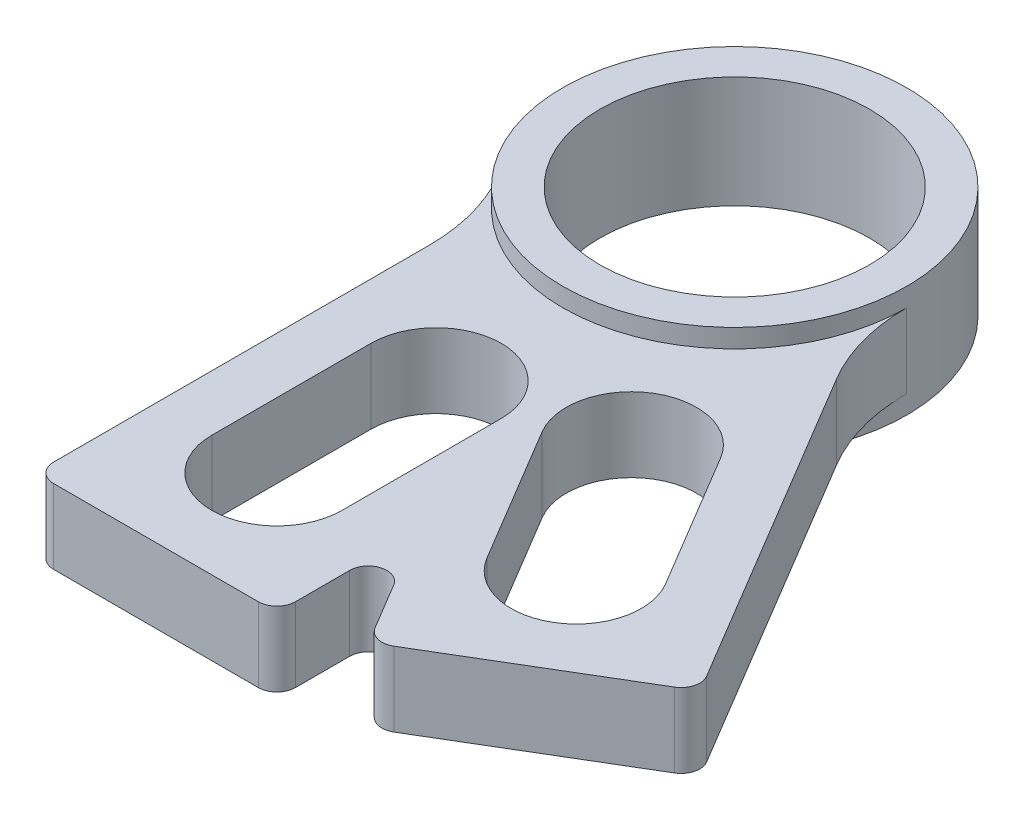
ISO-10303-21;
HEADER;
FILE_DESCRIPTION(('STEP AP214'),'2;1');
FILE_NAME('part.step','',(''),(''),'','','');
FILE_SCHEMA(('AUTOMOTIVE_DESIGN { 1 0 10303 214 1 1 1 1 }'));
ENDSEC;
DATA;
#1=APPLICATION_CONTEXT('core data for automotive mechanical design processes');
#2=APPLICATION_PROTOCOL_DEFINITION('international standard','automotive_design',2000,#1);
#3=PRODUCT_CONTEXT('',#1,'mechanical');
#4=PRODUCT('Part','Part','',(#3));
#5=PRODUCT_RELATED_PRODUCT_CATEGORY('part','',(#4));
#6=PRODUCT_DEFINITION_FORMATION('','',#4);
#7=PRODUCT_DEFINITION_CONTEXT('part definition',#1,'design');
#8=PRODUCT_DEFINITION('design','',#6,#7);
#9=PRODUCT_DEFINITION_SHAPE('','',#8);
#10=(LENGTH_UNIT() NAMED_UNIT(*) SI_UNIT(.MILLI.,.METRE.));
#11=(NAMED_UNIT(*) PLANE_ANGLE_UNIT() SI_UNIT($,.RADIAN.));
#12=(NAMED_UNIT(*) SI_UNIT($,.STERADIAN.) SOLID_ANGLE_UNIT());
#13=UNCERTAINTY_MEASURE_WITH_UNIT(LENGTH_MEASURE(1.E-05),#10,'distance_accuracy_value','');
#14=(GEOMETRIC_REPRESENTATION_CONTEXT(3) GLOBAL_UNCERTAINTY_ASSIGNED_CONTEXT((#13)) GLOBAL_UNIT_ASSIGNED_CONTEXT((#10,
#11,#12)) REPRESENTATION_CONTEXT('',''));
#15=CARTESIAN_POINT('',(0.,0.,0.));
#16=DIRECTION('',(0.,0.,1.));
#17=DIRECTION('',(1.,0.,0.));
#18=AXIS2_PLACEMENT_3D('',#15,#16,#17);
#19=CARTESIAN_POINT('',(0.,4.7625,0.));
#20=DIRECTION('',(0.,-1.,0.));
#21=DIRECTION('',(0.,0.,-1.));
#22=AXIS2_PLACEMENT_3D('',#19,#20,#21);
#23=CYLINDRICAL_SURFACE('',#22,11.5062);
#24=CARTESIAN_POINT('',(0.,4.7625,0.));
#25=DIRECTION('',(0.,1.,0.));
#26=DIRECTION('',(0.,0.,1.));
#27=AXIS2_PLACEMENT_3D('',#24,#25,#26);
#28=CIRCLE('',#27,11.5062);
#29=CARTESIAN_POINT('',(0.,4.7625,-11.5062));
#30=VERTEX_POINT('',#29);
#31=EDGE_CURVE('E299',#30,#30,#28,.T.);
#32=CARTESIAN_POINT('',(0.,-4.7625,0.));
#33=DIRECTION('',(0.,1.,0.));
#34=DIRECTION('',(0.,0.,1.));
#35=AXIS2_PLACEMENT_3D('',#32,#33,#34);
#36=CIRCLE('',#35,11.5062);
#37=CARTESIAN_POINT('',(0.,-4.7625,-11.5062));
#38=VERTEX_POINT('',#37);
#39=EDGE_CURVE('E294',#38,#38,#36,.T.);
#40=CARTESIAN_POINT('',(0.,4.7625,-11.5062));
#41=CARTESIAN_POINT('',(0.,4.66328125,-11.5062));
#42=CARTESIAN_POINT('',(0.,4.5640625,-11.5062));
#43=CARTESIAN_POINT('',(0.,4.365625,-11.5062));
#44=CARTESIAN_POINT('',(0.,4.26640625,-11.5062));
#45=CARTESIAN_POINT('',(0.,4.06796875,-11.5062));
#46=CARTESIAN_POINT('',(0.,3.96875,-11.5062));
#47=CARTESIAN_POINT('',(0.,3.7703125,-11.5062));
#48=CARTESIAN_POINT('',(0.,3.67109375,-11.5062));
#49=CARTESIAN_POINT('',(0.,3.47265625,-11.5062));
#50=CARTESIAN_POINT('',(0.,3.3734375,-11.5062));
#51=CARTESIAN_POINT('',(0.,3.175,-11.5062));
#52=CARTESIAN_POINT('',(0.,3.07578125,-11.5062));
#53=CARTESIAN_POINT('',(0.,2.87734375,-11.5062));
#54=CARTESIAN_POINT('',(0.,2.778125,-11.5062));
#55=CARTESIAN_POINT('',(0.,2.5796875,-11.5062));
#56=CARTESIAN_POINT('',(0.,2.48046875,-11.5062));
#57=CARTESIAN_POINT('',(0.,2.28203125,-11.5062));
#58=CARTESIAN_POINT('',(0.,2.1828125,-11.5062));
#59=CARTESIAN_POINT('',(0.,1.984375,-11.5062));
#60=CARTESIAN_POINT('',(0.,1.88515625,-11.5062));
#61=CARTESIAN_POINT('',(0.,1.68671875,-11.5062));
#62=CARTESIAN_POINT('',(0.,1.5875,-11.5062));
#63=CARTESIAN_POINT('',(0.,1.3890625,-11.5062));
#64=CARTESIAN_POINT('',(0.,1.28984375,-11.5062));
#65=CARTESIAN_POINT('',(0.,1.09140625,-11.5062));
#66=CARTESIAN_POINT('',(0.,0.992187499999999,-11.5062));
#67=CARTESIAN_POINT('',(0.,0.79375,-11.5062));
#68=CARTESIAN_POINT('',(0.,0.69453125,-11.5062));
#69=CARTESIAN_POINT('',(0.,0.49609375,-11.5062));
#70=CARTESIAN_POINT('',(0.,0.396875,-11.5062));
#71=CARTESIAN_POINT('',(0.,0.1984375,-11.5062));
#72=CARTESIAN_POINT('',(0.,0.0992187500000001,-11.5062));
#73=CARTESIAN_POINT('',(0.,-0.0992187500000001,-11.5062));
#74=CARTESIAN_POINT('',(0.,-0.1984375,-11.5062));
#75=CARTESIAN_POINT('',(0.,-0.396875,-11.5062));
#76=CARTESIAN_POINT('',(0.,-0.49609375,-11.5062));
#77=CARTESIAN_POINT('',(0.,-0.69453125,-11.5062));
#78=CARTESIAN_POINT('',(0.,-0.793750000000001,-11.5062));
#79=CARTESIAN_POINT('',(0.,-0.992187500000001,-11.5062));
#80=CARTESIAN_POINT('',(0.,-1.09140625,-11.5062));
#81=CARTESIAN_POINT('',(0.,-1.28984375,-11.5062));
#82=CARTESIAN_POINT('',(0.,-1.3890625,-11.5062));
#83=CARTESIAN_POINT('',(0.,-1.5875,-11.5062));
#84=CARTESIAN_POINT('',(0.,-1.68671875,-11.5062));
#85=CARTESIAN_POINT('',(0.,-1.88515625,-11.5062));
#86=CARTESIAN_POINT('',(0.,-1.984375,-11.5062));
#87=CARTESIAN_POINT('',(0.,-2.1828125,-11.5062));
#88=CARTESIAN_POINT('',(0.,-2.28203125,-11.5062));
#89=CARTESIAN_POINT('',(0.,-2.48046875,-11.5062));
#90=CARTESIAN_POINT('',(0.,-2.5796875,-11.5062));
#91=CARTESIAN_POINT('',(0.,-2.778125,-11.5062));
#92=CARTESIAN_POINT('',(0.,-2.87734375,-11.5062));
#93=CARTESIAN_POINT('',(0.,-3.07578125,-11.5062));
#94=CARTESIAN_POINT('',(0.,-3.175,-11.5062));
#95=CARTESIAN_POINT('',(0.,-3.3734375,-11.5062));
#96=CARTESIAN_POINT('',(0.,-3.47265625,-11.5062));
#97=CARTESIAN_POINT('',(0.,-3.67109375,-11.5062));
#98=CARTESIAN_POINT('',(0.,-3.7703125,-11.5062));
#99=CARTESIAN_POINT('',(0.,-3.96875,-11.5062));
#100=CARTESIAN_POINT('',(0.,-4.06796875,-11.5062));
#101=CARTESIAN_POINT('',(0.,-4.26640625,-11.5062));
#102=CARTESIAN_POINT('',(0.,-4.365625,-11.5062));
#103=CARTESIAN_POINT('',(0.,-4.5640625,-11.5062));
#104=CARTESIAN_POINT('',(0.,-4.66328125,-11.5062));
#105=CARTESIAN_POINT('',(0.,-4.7625,-11.5062));
#106=B_SPLINE_CURVE_WITH_KNOTS('',3,(#40,#41,#42,#43,#44,#45,#46,#47,#48,#49,#50,#51,#52,#53,
#54,#55,#56,#57,#58,#59,#60,#61,#62,#63,#64,#65,#66,#67,#68,#69,#70,#71,#72,#73,#74,#75,#76,#77,
#78,#79,#80,#81,#82,#83,#84,#85,#86,#87,#88,#89,#90,#91,#92,#93,#94,#95,#96,#97,#98,#99,#100,
#101,#102,#103,#104,#105),.UNSPECIFIED.,.F.,.F.,(4,2,2,2,2,2,2,2,2,2,2,2,2,2,2,2,2,2,2,2,2,2,2,
2,2,2,2,2,2,2,2,2,4),(0.,0.29765625,0.5953125,0.892968750000001,1.190625,1.48828125,1.7859375,
2.08359375,2.38125,2.67890625,2.9765625,3.27421875,3.571875,3.86953125,4.1671875,4.46484375,
4.7625,5.06015625,5.3578125,5.65546875,5.953125,6.25078125,6.5484375,6.84609375,7.14375,
7.44140625,7.7390625,8.03671875,8.334375,8.63203125,8.9296875,9.22734375,9.525),.UNSPECIFIED.);
#107=EDGE_CURVE('BSEAM41',#30,#38,#106,.T.);
#108=ORIENTED_EDGE('',*,*,#31,.T.);
#109=ORIENTED_EDGE('',*,*,#39,.F.);
#110=ORIENTED_EDGE('',*,*,#107,.T.);
#111=ORIENTED_EDGE('',*,*,#107,.F.);
#112=EDGE_LOOP('',(#108,#110,#109,#111));
#113=FACE_BOUND('',#112,.T.);
#114=ADVANCED_FACE('F41',(#113),#23,.F.);
#115=CARTESIAN_POINT('',(0.,4.7625,0.));
#116=DIRECTION('',(0.,-1.,0.));
#117=DIRECTION('',(0.,0.,-1.));
#118=AXIS2_PLACEMENT_3D('',#115,#116,#117);
#119=CYLINDRICAL_SURFACE('',#118,14.6812);
#120=DIRECTION('',(0.,-1.,0.));
#121=VECTOR('',#120,1.);
#122=CARTESIAN_POINT('',(14.6811803073208,4.7625,0.0240462873786636));
#123=LINE('',#122,#121);
#124=CARTESIAN_POINT('',(14.6811803073208,3.175,0.0240462873786636));
#125=VERTEX_POINT('',#124);
#126=CARTESIAN_POINT('',(14.6811803073208,-3.175,0.0240462873786636));
#127=VERTEX_POINT('',#126);
#128=EDGE_CURVE('E313',#125,#127,#123,.T.);
#129=ORIENTED_EDGE('',*,*,#128,.T.);
#130=CARTESIAN_POINT('',(0.,-3.175,0.));
#131=DIRECTION('',(0.,1.,0.));
#132=DIRECTION('',(0.,0.,1.));
#133=AXIS2_PLACEMENT_3D('',#130,#131,#132);
#134=CIRCLE('',#133,14.6812);
#135=CARTESIAN_POINT('',(-12.5938687913907,-3.175,7.54533646070437));
#136=VERTEX_POINT('',#135);
#137=EDGE_CURVE('E270',#136,#127,#134,.T.);
#138=ORIENTED_EDGE('',*,*,#137,.F.);
#139=DIRECTION('',(0.,-1.,0.));
#140=VECTOR('',#139,1.);
#141=CARTESIAN_POINT('',(-12.5938687913907,4.7625,7.54533646070436));
#142=LINE('',#141,#140);
#143=CARTESIAN_POINT('',(-12.5938687913907,3.175,7.54533646070437));
#144=VERTEX_POINT('',#143);
#145=EDGE_CURVE('E306',#136,#144,#142,.F.);
#146=ORIENTED_EDGE('',*,*,#145,.T.);
#147=CARTESIAN_POINT('',(0.,3.175,0.));
#148=DIRECTION('',(0.,1.,0.));
#149=DIRECTION('',(0.,0.,1.));
#150=AXIS2_PLACEMENT_3D('',#147,#148,#149);
#151=CIRCLE('',#150,14.6812);
#152=EDGE_CURVE('E232',#144,#125,#151,.T.);
#153=ORIENTED_EDGE('',*,*,#152,.T.);
#154=EDGE_LOOP('',(#129,#138,#146,#153));
#155=FACE_BOUND('',#154,.T.);
#156=CARTESIAN_POINT('',(0.,4.7625,0.));
#157=DIRECTION('',(0.,1.,0.));
#158=DIRECTION('',(0.,0.,1.));
#159=AXIS2_PLACEMENT_3D('',#156,#157,#158);
#160=CIRCLE('',#159,14.6812);
#161=CARTESIAN_POINT('',(0.,4.7625,14.6812));
#162=VERTEX_POINT('',#161);
#163=EDGE_CURVE('E302',#162,#162,#160,.T.);
#164=ORIENTED_EDGE('',*,*,#163,.F.);
#165=EDGE_LOOP('',(#164));
#166=FACE_BOUND('',#165,.T.);
#167=CARTESIAN_POINT('',(0.,-4.7625,0.));
#168=DIRECTION('',(0.,1.,0.));
#169=DIRECTION('',(0.,0.,1.));
#170=AXIS2_PLACEMENT_3D('',#167,#168,#169);
#171=CIRCLE('',#170,14.6812);
#172=CARTESIAN_POINT('',(0.,-4.7625,14.6812));
#173=VERTEX_POINT('',#172);
#174=EDGE_CURVE('E303',#173,#173,#171,.T.);
#175=ORIENTED_EDGE('',*,*,#174,.T.);
#176=EDGE_LOOP('',(#175));
#177=FACE_BOUND('',#176,.T.);
#178=ADVANCED_FACE('F409',(#155,#166,#177),#119,.T.);
#179=CARTESIAN_POINT('',(0.,4.7625,0.));
#180=DIRECTION('',(0.,1.,0.));
#181=DIRECTION('',(0.,0.,1.));
#182=AXIS2_PLACEMENT_3D('',#179,#180,#181);
#183=PLANE('',#182);
#184=ORIENTED_EDGE('',*,*,#31,.F.);
#185=EDGE_LOOP('',(#184));
#186=FACE_BOUND('',#185,.T.);
#187=ORIENTED_EDGE('',*,*,#163,.T.);
#188=EDGE_LOOP('',(#187));
#189=FACE_BOUND('',#188,.T.);
#190=ADVANCED_FACE('F445',(#186,#189),#183,.T.);
#191=CARTESIAN_POINT('',(0.,-4.7625,0.));
#192=DIRECTION('',(0.,1.,0.));
#193=DIRECTION('',(0.,0.,1.));
#194=AXIS2_PLACEMENT_3D('',#191,#192,#193);
#195=PLANE('',#194);
#196=ORIENTED_EDGE('',*,*,#39,.T.);
#197=EDGE_LOOP('',(#196));
#198=FACE_BOUND('',#197,.T.);
#199=ORIENTED_EDGE('',*,*,#174,.F.);
#200=EDGE_LOOP('',(#199));
#201=FACE_BOUND('',#200,.T.);
#202=ADVANCED_FACE('F619',(#198,#201),#195,.F.);
#203=CARTESIAN_POINT('',(-10.31875,3.175,0.));
#204=DIRECTION('',(-1.,0.,0.));
#205=DIRECTION('',(0.,0.,1.));
#206=AXIS2_PLACEMENT_3D('',#203,#204,#205);
#207=PLANE('',#206);
#208=DIRECTION('',(0.,0.,-1.));
#209=VECTOR('',#208,1.);
#210=CARTESIAN_POINT('',(-10.31875,-3.175,0.));
#211=LINE('',#210,#209);
#212=CARTESIAN_POINT('',(-10.31875,-3.175,47.8028));
#213=VERTEX_POINT('',#212);
#214=CARTESIAN_POINT('',(-10.31875,-3.175,15.7694921185655));
#215=VERTEX_POINT('',#214);
#216=EDGE_CURVE('E272',#213,#215,#211,.T.);
#217=ORIENTED_EDGE('',*,*,#216,.F.);
#218=DIRECTION('',(0.,-1.,0.));
#219=VECTOR('',#218,1.);
#220=CARTESIAN_POINT('',(-10.31875,3.175,47.8028));
#221=LINE('',#220,#219);
#222=CARTESIAN_POINT('',(-10.31875,3.175,47.8028));
#223=VERTEX_POINT('',#222);
#224=EDGE_CURVE('E372',#213,#223,#221,.F.);
#225=ORIENTED_EDGE('',*,*,#224,.T.);
#226=DIRECTION('',(0.,0.,-1.));
#227=VECTOR('',#226,1.);
#228=CARTESIAN_POINT('',(-10.31875,3.175,0.));
#229=LINE('',#228,#227);
#230=CARTESIAN_POINT('',(-10.31875,3.175,15.7694921185655));
#231=VERTEX_POINT('',#230);
#232=EDGE_CURVE('E234',#223,#231,#229,.T.);
#233=ORIENTED_EDGE('',*,*,#232,.T.);
#234=DIRECTION('',(0.,-1.,0.));
#235=VECTOR('',#234,1.);
#236=CARTESIAN_POINT('',(-10.31875,3.175,15.7694921185655));
#237=LINE('',#236,#235);
#238=EDGE_CURVE('E319',#231,#215,#237,.T.);
#239=ORIENTED_EDGE('',*,*,#238,.T.);
#240=EDGE_LOOP('',(#217,#225,#233,#239));
#241=FACE_BOUND('',#240,.T.);
#242=ADVANCED_FACE('F611',(#241),#207,.T.);
#243=CARTESIAN_POINT('',(0.,3.175,49.3903));
#244=DIRECTION('',(0.,0.,-1.));
#245=DIRECTION('',(-1.,0.,0.));
#246=AXIS2_PLACEMENT_3D('',#243,#244,#245);
#247=PLANE('',#246);
#248=DIRECTION('',(1.,0.,0.));
#249=VECTOR('',#248,1.);
#250=CARTESIAN_POINT('',(0.,-3.175,49.3903));
#251=LINE('',#250,#249);
#252=CARTESIAN_POINT('',(-8.73124999999999,-3.175,49.3903));
#253=VERTEX_POINT('',#252);
#254=CARTESIAN_POINT('',(8.73125,-3.175,49.3903));
#255=VERTEX_POINT('',#254);
#256=EDGE_CURVE('E274',#253,#255,#251,.T.);
#257=ORIENTED_EDGE('',*,*,#256,.T.);
#258=DIRECTION('',(0.,-1.,0.));
#259=VECTOR('',#258,1.);
#260=CARTESIAN_POINT('',(8.73125,3.175,49.3903));
#261=LINE('',#260,#259);
#262=CARTESIAN_POINT('',(8.73125,3.175,49.3903));
#263=VERTEX_POINT('',#262);
#264=EDGE_CURVE('E370',#255,#263,#261,.F.);
#265=ORIENTED_EDGE('',*,*,#264,.T.);
#266=DIRECTION('',(1.,0.,0.));
#267=VECTOR('',#266,1.);
#268=CARTESIAN_POINT('',(0.,3.175,49.3903));
#269=LINE('',#268,#267);
#270=CARTESIAN_POINT('',(-8.73124999999999,3.175,49.3903));
#271=VERTEX_POINT('',#270);
#272=EDGE_CURVE('E236',#271,#263,#269,.T.);
#273=ORIENTED_EDGE('',*,*,#272,.F.);
#274=DIRECTION('',(0.,-1.,0.));
#275=VECTOR('',#274,1.);
#276=CARTESIAN_POINT('',(-8.73124999999999,-3.175,49.3903));
#277=LINE('',#276,#275);
#278=EDGE_CURVE('E367',#271,#253,#277,.T.);
#279=ORIENTED_EDGE('',*,*,#278,.T.);
#280=EDGE_LOOP('',(#257,#265,#273,#279));
#281=FACE_BOUND('',#280,.T.);
#282=ADVANCED_FACE('F426',(#281),#247,.F.);
#283=CARTESIAN_POINT('',(10.31875,3.175,0.));
#284=DIRECTION('',(-1.,0.,0.));
#285=DIRECTION('',(0.,0.,1.));
#286=AXIS2_PLACEMENT_3D('',#283,#284,#285);
#287=PLANE('',#286);
#288=DIRECTION('',(0.,0.,-1.));
#289=VECTOR('',#288,1.);
#290=CARTESIAN_POINT('',(10.31875,-3.175,0.));
#291=LINE('',#290,#289);
#292=CARTESIAN_POINT('',(10.31875,-3.175,47.8028));
#293=VERTEX_POINT('',#292);
#294=CARTESIAN_POINT('',(10.31875,-3.175,43.1765755406219));
#295=VERTEX_POINT('',#294);
#296=EDGE_CURVE('E277',#293,#295,#291,.T.);
#297=ORIENTED_EDGE('',*,*,#296,.T.);
#298=DIRECTION('',(0.,-1.,0.));
#299=VECTOR('',#298,1.);
#300=CARTESIAN_POINT('',(10.31875,3.175,43.1765755406219));
#301=LINE('',#300,#299);
#302=CARTESIAN_POINT('',(10.31875,3.175,43.1765755406219));
#303=VERTEX_POINT('',#302);
#304=EDGE_CURVE('E365',#295,#303,#301,.F.);
#305=ORIENTED_EDGE('',*,*,#304,.T.);
#306=DIRECTION('',(0.,0.,-1.));
#307=VECTOR('',#306,1.);
#308=CARTESIAN_POINT('',(10.31875,3.175,0.));
#309=LINE('',#308,#307);
#310=CARTESIAN_POINT('',(10.31875,3.175,47.8028));
#311=VERTEX_POINT('',#310);
#312=EDGE_CURVE('E239',#311,#303,#309,.T.);
#313=ORIENTED_EDGE('',*,*,#312,.F.);
#314=DIRECTION('',(0.,-1.,0.));
#315=VECTOR('',#314,1.);
#316=CARTESIAN_POINT('',(10.31875,3.175,47.8028));
#317=LINE('',#316,#315);
#318=EDGE_CURVE('E362',#311,#293,#317,.T.);
#319=ORIENTED_EDGE('',*,*,#318,.T.);
#320=EDGE_LOOP('',(#297,#305,#313,#319));
#321=FACE_BOUND('',#320,.T.);
#322=ADVANCED_FACE('F381',(#321),#287,.F.);
#323=CARTESIAN_POINT('',(-8.8603338523033,3.175,5.28876976131757));
#324=DIRECTION('',(-0.858663486595115,0.,0.512539770933262));
#325=DIRECTION('',(0.512539770933262,0.,0.858663486595115));
#326=AXIS2_PLACEMENT_3D('',#323,#324,#325);
#327=PLANE('',#326);
#328=DIRECTION('',(-0.512539770933262,0.,-0.858663486595115));
#329=VECTOR('',#328,1.);
#330=CARTESIAN_POINT('',(-8.8603338523033,-3.175,5.28876976131757));
#331=LINE('',#330,#329);
#332=CARTESIAN_POINT('',(15.6405023096652,-3.175,46.3352886783265));
#333=VERTEX_POINT('',#332);
#334=CARTESIAN_POINT('',(13.2693782849697,-3.175,42.3629186542654));
#335=VERTEX_POINT('',#334);
#336=EDGE_CURVE('E280',#333,#335,#331,.T.);
#337=ORIENTED_EDGE('',*,*,#336,.F.);
#338=DIRECTION('',(0.,-1.,0.));
#339=VECTOR('',#338,1.);
#340=CARTESIAN_POINT('',(15.6405023096652,3.175,46.3352886783265));
#341=LINE('',#340,#339);
#342=CARTESIAN_POINT('',(15.6405023096652,3.175,46.3352886783265));
#343=VERTEX_POINT('',#342);
#344=EDGE_CURVE('E61',#333,#343,#341,.F.);
#345=ORIENTED_EDGE('',*,*,#344,.T.);
#346=DIRECTION('',(-0.512539770933262,0.,-0.858663486595115));
#347=VECTOR('',#346,1.);
#348=CARTESIAN_POINT('',(-8.8603338523033,3.175,5.28876976131757));
#349=LINE('',#348,#347);
#350=CARTESIAN_POINT('',(13.2693782849697,3.175,42.3629186542654));
#351=VERTEX_POINT('',#350);
#352=EDGE_CURVE('E241',#343,#351,#349,.T.);
#353=ORIENTED_EDGE('',*,*,#352,.T.);
#354=DIRECTION('',(0.,-1.,0.));
#355=VECTOR('',#354,1.);
#356=CARTESIAN_POINT('',(13.2693782849698,3.175,42.3629186542654));
#357=LINE('',#356,#355);
#358=EDGE_CURVE('E358',#351,#335,#357,.T.);
#359=ORIENTED_EDGE('',*,*,#358,.T.);
#360=EDGE_LOOP('',(#337,#345,#353,#359));
#361=FACE_BOUND('',#360,.T.);
#362=ADVANCED_FACE('F385',(#361),#327,.T.);
#363=CARTESIAN_POINT('',(25.3144930483251,3.175,42.4096472019787));
#364=DIRECTION('',(-0.512539770933262,0.,-0.858663486595115));
#365=DIRECTION('',(-0.858663486595115,0.,0.512539770933262));
#366=AXIS2_PLACEMENT_3D('',#363,#364,#365);
#367=PLANE('',#366);
#368=DIRECTION('',(0.858663486595115,0.,-0.512539770933262));
#369=VECTOR('',#368,1.);
#370=CARTESIAN_POINT('',(25.3144930483251,-3.175,42.4096472019787));
#371=LINE('',#370,#369);
#372=CARTESIAN_POINT('',(17.8172874809915,-3.175,46.8847600769397));
#373=VERTEX_POINT('',#372);
#374=CARTESIAN_POINT('',(32.8116986156587,-3.175,37.9345343270176));
#375=VERTEX_POINT('',#374);
#376=EDGE_CURVE('E283',#373,#375,#371,.T.);
#377=ORIENTED_EDGE('',*,*,#376,.T.);
#378=DIRECTION('',(0.,-1.,0.));
#379=VECTOR('',#378,1.);
#380=CARTESIAN_POINT('',(32.8116986156587,3.175,37.9345343270176));
#381=LINE('',#380,#379);
#382=CARTESIAN_POINT('',(32.8116986156587,3.175,37.9345343270176));
#383=VERTEX_POINT('',#382);
#384=EDGE_CURVE('E348',#375,#383,#381,.F.);
#385=ORIENTED_EDGE('',*,*,#384,.T.);
#386=DIRECTION('',(0.858663486595115,0.,-0.512539770933262));
#387=VECTOR('',#386,1.);
#388=CARTESIAN_POINT('',(25.3144930483251,3.175,42.4096472019787));
#389=LINE('',#388,#387);
#390=CARTESIAN_POINT('',(17.8172874809915,3.175,46.8847600769397));
#391=VERTEX_POINT('',#390);
#392=EDGE_CURVE('E243',#391,#383,#389,.T.);
#393=ORIENTED_EDGE('',*,*,#392,.F.);
#394=DIRECTION('',(0.,-1.,0.));
#395=VECTOR('',#394,1.);
#396=CARTESIAN_POINT('',(17.8172874809915,-3.175,46.8847600769397));
#397=LINE('',#396,#395);
#398=EDGE_CURVE('E345',#391,#373,#397,.T.);
#399=ORIENTED_EDGE('',*,*,#398,.T.);
#400=EDGE_LOOP('',(#377,#385,#393,#399));
#401=FACE_BOUND('',#400,.T.);
#402=ADVANCED_FACE('F393',(#401),#367,.F.);
#403=CARTESIAN_POINT('',(0.,3.175,25.48255));
#404=DIRECTION('',(0.,-1.,0.));
#405=DIRECTION('',(0.,0.,-1.));
#406=AXIS2_PLACEMENT_3D('',#403,#404,#405);
#407=CYLINDRICAL_SURFACE('',#406,5.55625);
#408=CARTESIAN_POINT('',(0.,-3.175,25.48255));
#409=DIRECTION('',(0.,1.,0.));
#410=DIRECTION('',(0.,0.,1.));
#411=AXIS2_PLACEMENT_3D('',#408,#409,#410);
#412=CIRCLE('',#411,5.55625);
#413=CARTESIAN_POINT('',(5.55625,-3.175,25.48255));
#414=VERTEX_POINT('',#413);
#415=CARTESIAN_POINT('',(-5.55624999999999,-3.175,25.48255));
#416=VERTEX_POINT('',#415);
#417=EDGE_CURVE('E258',#414,#416,#412,.T.);
#418=ORIENTED_EDGE('',*,*,#417,.F.);
#419=DIRECTION('',(0.,-1.,0.));
#420=VECTOR('',#419,1.);
#421=CARTESIAN_POINT('',(5.55625,3.175,25.48255));
#422=LINE('',#421,#420);
#423=CARTESIAN_POINT('',(5.55625,3.175,25.48255));
#424=VERTEX_POINT('',#423);
#425=EDGE_CURVE('E292',#424,#414,#422,.T.);
#426=ORIENTED_EDGE('',*,*,#425,.F.);
#427=CARTESIAN_POINT('',(0.,3.175,25.48255));
#428=DIRECTION('',(0.,1.,0.));
#429=DIRECTION('',(0.,0.,1.));
#430=AXIS2_PLACEMENT_3D('',#427,#428,#429);
#431=CIRCLE('',#430,5.55625);
#432=CARTESIAN_POINT('',(-5.55624999999999,3.175,25.48255));
#433=VERTEX_POINT('',#432);
#434=EDGE_CURVE('E221',#424,#433,#431,.T.);
#435=ORIENTED_EDGE('',*,*,#434,.T.);
#436=DIRECTION('',(0.,-1.,0.));
#437=VECTOR('',#436,1.);
#438=CARTESIAN_POINT('',(-5.55624999999999,3.175,25.48255));
#439=LINE('',#438,#437);
#440=EDGE_CURVE('E200',#433,#416,#439,.T.);
#441=ORIENTED_EDGE('',*,*,#440,.T.);
#442=EDGE_LOOP('',(#418,#426,#435,#441));
#443=FACE_BOUND('',#442,.T.);
#444=ADVANCED_FACE('F573',(#443),#407,.F.);
#445=CARTESIAN_POINT('',(5.55625,3.175,0.));
#446=DIRECTION('',(-1.,0.,0.));
#447=DIRECTION('',(0.,0.,1.));
#448=AXIS2_PLACEMENT_3D('',#445,#446,#447);
#449=PLANE('',#448);
#450=DIRECTION('',(0.,0.,-1.));
#451=VECTOR('',#450,1.);
#452=CARTESIAN_POINT('',(5.55625,-3.175,0.));
#453=LINE('',#452,#451);
#454=CARTESIAN_POINT('',(5.55625,-3.175,39.07155));
#455=VERTEX_POINT('',#454);
#456=EDGE_CURVE('E261',#455,#414,#453,.T.);
#457=ORIENTED_EDGE('',*,*,#456,.F.);
#458=DIRECTION('',(0.,-1.,0.));
#459=VECTOR('',#458,1.);
#460=CARTESIAN_POINT('',(5.55625,3.175,39.07155));
#461=LINE('',#460,#459);
#462=CARTESIAN_POINT('',(5.55625,3.175,39.07155));
#463=VERTEX_POINT('',#462);
#464=EDGE_CURVE('E290',#463,#455,#461,.T.);
#465=ORIENTED_EDGE('',*,*,#464,.F.);
#466=DIRECTION('',(0.,0.,-1.));
#467=VECTOR('',#466,1.);
#468=CARTESIAN_POINT('',(5.55625,3.175,0.));
#469=LINE('',#468,#467);
#470=EDGE_CURVE('E224',#463,#424,#469,.T.);
#471=ORIENTED_EDGE('',*,*,#470,.T.);
#472=ORIENTED_EDGE('',*,*,#425,.T.);
#473=EDGE_LOOP('',(#457,#465,#471,#472));
#474=FACE_BOUND('',#473,.T.);
#475=ADVANCED_FACE('F564',(#474),#449,.T.);
#476=CARTESIAN_POINT('',(0.,3.175,39.07155));
#477=DIRECTION('',(0.,-1.,0.));
#478=DIRECTION('',(0.,0.,-1.));
#479=AXIS2_PLACEMENT_3D('',#476,#477,#478);
#480=CYLINDRICAL_SURFACE('',#479,5.55625);
#481=CARTESIAN_POINT('',(0.,-3.175,39.07155));
#482=DIRECTION('',(0.,1.,0.));
#483=DIRECTION('',(0.,0.,1.));
#484=AXIS2_PLACEMENT_3D('',#481,#482,#483);
#485=CIRCLE('',#484,5.55625);
#486=CARTESIAN_POINT('',(-5.55625,-3.175,39.07155));
#487=VERTEX_POINT('',#486);
#488=EDGE_CURVE('E264',#487,#455,#485,.T.);
#489=ORIENTED_EDGE('',*,*,#488,.F.);
#490=DIRECTION('',(0.,-1.,0.));
#491=VECTOR('',#490,1.);
#492=CARTESIAN_POINT('',(-5.55625,3.175,39.07155));
#493=LINE('',#492,#491);
#494=CARTESIAN_POINT('',(-5.55625,3.175,39.07155));
#495=VERTEX_POINT('',#494);
#496=EDGE_CURVE('E288',#495,#487,#493,.T.);
#497=ORIENTED_EDGE('',*,*,#496,.F.);
#498=CARTESIAN_POINT('',(0.,3.175,39.07155));
#499=DIRECTION('',(0.,1.,0.));
#500=DIRECTION('',(0.,0.,1.));
#501=AXIS2_PLACEMENT_3D('',#498,#499,#500);
#502=CIRCLE('',#501,5.55625);
#503=EDGE_CURVE('E227',#495,#463,#502,.T.);
#504=ORIENTED_EDGE('',*,*,#503,.T.);
#505=ORIENTED_EDGE('',*,*,#464,.T.);
#506=EDGE_LOOP('',(#489,#497,#504,#505));
#507=FACE_BOUND('',#506,.T.);
#508=ADVANCED_FACE('F556',(#507),#480,.F.);
#509=CARTESIAN_POINT('',(13.0608203397954,3.175,21.8809352303343));
#510=DIRECTION('',(0.,-1.,0.));
#511=DIRECTION('',(0.,0.,-1.));
#512=AXIS2_PLACEMENT_3D('',#509,#510,#511);
#513=CYLINDRICAL_SURFACE('',#512,5.55624999999999);
#514=CARTESIAN_POINT('',(13.0608203397954,-3.175,21.8809352303343));
#515=DIRECTION('',(0.,1.,0.));
#516=DIRECTION('',(0.,0.,1.));
#517=AXIS2_PLACEMENT_3D('',#514,#515,#516);
#518=CIRCLE('',#517,5.55624999999999);
#519=CARTESIAN_POINT('',(17.8317693371895,-3.175,19.0331361280864));
#520=VERTEX_POINT('',#519);
#521=CARTESIAN_POINT('',(8.28987134240132,-3.175,24.7287343325823));
#522=VERTEX_POINT('',#521);
#523=EDGE_CURVE('E195',#520,#522,#518,.T.);
#524=ORIENTED_EDGE('',*,*,#523,.F.);
#525=DIRECTION('',(0.,-1.,0.));
#526=VECTOR('',#525,1.);
#527=CARTESIAN_POINT('',(17.8317693371895,3.175,19.0331361280864));
#528=LINE('',#527,#526);
#529=CARTESIAN_POINT('',(17.8317693371895,3.175,19.0331361280864));
#530=VERTEX_POINT('',#529);
#531=EDGE_CURVE('E190',#530,#520,#528,.T.);
#532=ORIENTED_EDGE('',*,*,#531,.F.);
#533=CARTESIAN_POINT('',(13.0608203397954,3.175,21.8809352303343));
#534=DIRECTION('',(0.,1.,0.));
#535=DIRECTION('',(0.,0.,1.));
#536=AXIS2_PLACEMENT_3D('',#533,#534,#535);
#537=CIRCLE('',#536,5.55624999999999);
#538=CARTESIAN_POINT('',(8.28987134240132,3.175,24.7287343325823));
#539=VERTEX_POINT('',#538);
#540=EDGE_CURVE('E193',#530,#539,#537,.T.);
#541=ORIENTED_EDGE('',*,*,#540,.T.);
#542=DIRECTION('',(0.,-1.,0.));
#543=VECTOR('',#542,1.);
#544=CARTESIAN_POINT('',(8.28987134240132,3.175,24.7287343325823));
#545=LINE('',#544,#543);
#546=EDGE_CURVE('E248',#539,#522,#545,.T.);
#547=ORIENTED_EDGE('',*,*,#546,.T.);
#548=EDGE_LOOP('',(#524,#532,#541,#547));
#549=FACE_BOUND('',#548,.T.);
#550=ADVANCED_FACE('F192',(#549),#513,.F.);
#551=CARTESIAN_POINT('',(4.77094899739411,3.175,-2.84779910224794));
#552=DIRECTION('',(-0.858663486595115,0.,0.512539770933262));
#553=DIRECTION('',(0.512539770933262,0.,0.858663486595115));
#554=AXIS2_PLACEMENT_3D('',#551,#552,#553);
#555=PLANE('',#554);
#556=DIRECTION('',(-0.512539770933262,0.,-0.858663486595115));
#557=VECTOR('',#556,1.);
#558=CARTESIAN_POINT('',(4.77094899739411,-3.175,-2.84779910224794));
#559=LINE('',#558,#557);
#560=CARTESIAN_POINT('',(24.7966722844016,-3.175,30.7015142474274));
#561=VERTEX_POINT('',#560);
#562=EDGE_CURVE('E250',#561,#520,#559,.T.);
#563=ORIENTED_EDGE('',*,*,#562,.F.);
#564=DIRECTION('',(0.,-1.,0.));
#565=VECTOR('',#564,1.);
#566=CARTESIAN_POINT('',(24.7966722844016,3.175,30.7015142474274));
#567=LINE('',#566,#565);
#568=CARTESIAN_POINT('',(24.7966722844016,3.175,30.7015142474274));
#569=VERTEX_POINT('',#568);
#570=EDGE_CURVE('E201',#569,#561,#567,.T.);
#571=ORIENTED_EDGE('',*,*,#570,.F.);
#572=DIRECTION('',(-0.512539770933262,0.,-0.858663486595115));
#573=VECTOR('',#572,1.);
#574=CARTESIAN_POINT('',(4.77094899739411,3.175,-2.84779910224794));
#575=LINE('',#574,#573);
#576=EDGE_CURVE('E208',#569,#530,#575,.T.);
#577=ORIENTED_EDGE('',*,*,#576,.T.);
#578=ORIENTED_EDGE('',*,*,#531,.T.);
#579=EDGE_LOOP('',(#563,#571,#577,#578));
#580=FACE_BOUND('',#579,.T.);
#581=ADVANCED_FACE('F215',(#580),#555,.T.);
#582=CARTESIAN_POINT('',(20.0257232870075,3.175,33.5493133496754));
#583=DIRECTION('',(0.,-1.,0.));
#584=DIRECTION('',(0.,0.,-1.));
#585=AXIS2_PLACEMENT_3D('',#582,#583,#584);
#586=CYLINDRICAL_SURFACE('',#585,5.55624999999999);
#587=CARTESIAN_POINT('',(20.0257232870075,-3.175,33.5493133496754));
#588=DIRECTION('',(0.,1.,0.));
#589=DIRECTION('',(0.,0.,1.));
#590=AXIS2_PLACEMENT_3D('',#587,#588,#589);
#591=CIRCLE('',#590,5.55624999999999);
#592=CARTESIAN_POINT('',(15.2547742896134,-3.175,36.3971124519233));
#593=VERTEX_POINT('',#592);
#594=EDGE_CURVE('E252',#593,#561,#591,.T.);
#595=ORIENTED_EDGE('',*,*,#594,.F.);
#596=DIRECTION('',(0.,-1.,0.));
#597=VECTOR('',#596,1.);
#598=CARTESIAN_POINT('',(15.2547742896134,3.175,36.3971124519233));
#599=LINE('',#598,#597);
#600=CARTESIAN_POINT('',(15.2547742896134,3.175,36.3971124519233));
#601=VERTEX_POINT('',#600);
#602=EDGE_CURVE('E296',#601,#593,#599,.T.);
#603=ORIENTED_EDGE('',*,*,#602,.F.);
#604=CARTESIAN_POINT('',(20.0257232870075,3.175,33.5493133496754));
#605=DIRECTION('',(0.,1.,0.));
#606=DIRECTION('',(0.,0.,1.));
#607=AXIS2_PLACEMENT_3D('',#604,#605,#606);
#608=CIRCLE('',#607,5.55624999999999);
#609=EDGE_CURVE('E216',#601,#569,#608,.T.);
#610=ORIENTED_EDGE('',*,*,#609,.T.);
#611=ORIENTED_EDGE('',*,*,#570,.T.);
#612=EDGE_LOOP('',(#595,#603,#610,#611));
#613=FACE_BOUND('',#612,.T.);
#614=ADVANCED_FACE('F532',(#613),#586,.F.);
#615=CARTESIAN_POINT('',(-5.55624999999999,3.175,0.));
#616=DIRECTION('',(-1.,0.,0.));
#617=DIRECTION('',(0.,0.,1.));
#618=AXIS2_PLACEMENT_3D('',#615,#616,#617);
#619=PLANE('',#618);
#620=DIRECTION('',(0.,0.,-1.));
#621=VECTOR('',#620,1.);
#622=CARTESIAN_POINT('',(-5.55624999999999,-3.175,0.));
#623=LINE('',#622,#621);
#624=EDGE_CURVE('E267',#487,#416,#623,.T.);
#625=ORIENTED_EDGE('',*,*,#624,.T.);
#626=ORIENTED_EDGE('',*,*,#440,.F.);
#627=DIRECTION('',(0.,0.,-1.));
#628=VECTOR('',#627,1.);
#629=CARTESIAN_POINT('',(-5.55624999999999,3.175,0.));
#630=LINE('',#629,#628);
#631=EDGE_CURVE('E230',#495,#433,#630,.T.);
#632=ORIENTED_EDGE('',*,*,#631,.F.);
#633=ORIENTED_EDGE('',*,*,#496,.T.);
#634=EDGE_LOOP('',(#625,#626,#632,#633));
#635=FACE_BOUND('',#634,.T.);
#636=ADVANCED_FACE('F523',(#635),#619,.F.);
#637=CARTESIAN_POINT('',(-4.77094899739408,3.175,2.84779910224792));
#638=DIRECTION('',(-0.858663486595115,0.,0.512539770933262));
#639=DIRECTION('',(0.512539770933262,0.,0.858663486595115));
#640=AXIS2_PLACEMENT_3D('',#637,#638,#639);
#641=PLANE('',#640);
#642=DIRECTION('',(-0.512539770933262,0.,-0.858663486595115));
#643=VECTOR('',#642,1.);
#644=CARTESIAN_POINT('',(-4.77094899739408,-3.175,2.84779910224792));
#645=LINE('',#644,#643);
#646=EDGE_CURVE('E255',#593,#522,#645,.T.);
#647=ORIENTED_EDGE('',*,*,#646,.T.);
#648=ORIENTED_EDGE('',*,*,#546,.F.);
#649=DIRECTION('',(-0.512539770933262,0.,-0.858663486595115));
#650=VECTOR('',#649,1.);
#651=CARTESIAN_POINT('',(-4.77094899739408,3.175,2.84779910224792));
#652=LINE('',#651,#650);
#653=EDGE_CURVE('E211',#601,#539,#652,.T.);
#654=ORIENTED_EDGE('',*,*,#653,.F.);
#655=ORIENTED_EDGE('',*,*,#602,.T.);
#656=EDGE_LOOP('',(#647,#648,#654,#655));
#657=FACE_BOUND('',#656,.T.);
#658=ADVANCED_FACE('F515',(#657),#641,.F.);
#659=CARTESIAN_POINT('',(8.86033385230336,3.175,-5.28876976131761));
#660=DIRECTION('',(-0.858663486595115,0.,0.512539770933262));
#661=DIRECTION('',(0.512539770933262,0.,0.858663486595115));
#662=AXIS2_PLACEMENT_3D('',#659,#660,#661);
#663=PLANE('',#662);
#664=DIRECTION('',(-0.512539770933262,0.,-0.858663486595115));
#665=VECTOR('',#664,1.);
#666=CARTESIAN_POINT('',(8.86033385230336,3.175,-5.28876976131761));
#667=LINE('',#666,#665);
#668=CARTESIAN_POINT('',(33.3611700142719,3.175,35.7577491556913));
#669=VERTEX_POINT('',#668);
#670=CARTESIAN_POINT('',(16.9428257304868,3.175,8.251917323044));
#671=VERTEX_POINT('',#670);
#672=EDGE_CURVE('E246',#669,#671,#667,.T.);
#673=ORIENTED_EDGE('',*,*,#672,.F.);
#674=DIRECTION('',(0.,-1.,0.));
#675=VECTOR('',#674,1.);
#676=CARTESIAN_POINT('',(33.3611700142719,3.175,35.7577491556913));
#677=LINE('',#676,#675);
#678=CARTESIAN_POINT('',(33.3611700142719,-3.175,35.7577491556913));
#679=VERTEX_POINT('',#678);
#680=EDGE_CURVE('E334',#669,#679,#677,.T.);
#681=ORIENTED_EDGE('',*,*,#680,.T.);
#682=DIRECTION('',(-0.512539770933262,0.,-0.858663486595115));
#683=VECTOR('',#682,1.);
#684=CARTESIAN_POINT('',(8.86033385230336,-3.175,-5.28876976131761));
#685=LINE('',#684,#683);
#686=CARTESIAN_POINT('',(16.9428257304868,-3.175,8.251917323044));
#687=VERTEX_POINT('',#686);
#688=EDGE_CURVE('E213',#679,#687,#685,.T.);
#689=ORIENTED_EDGE('',*,*,#688,.T.);
#690=DIRECTION('',(0.,1.,0.));
#691=VECTOR('',#690,1.);
#692=CARTESIAN_POINT('',(16.9428257304868,3.175,8.251917323044));
#693=LINE('',#692,#691);
#694=EDGE_CURVE('E316',#687,#671,#693,.T.);
#695=ORIENTED_EDGE('',*,*,#694,.T.);
#696=EDGE_LOOP('',(#673,#681,#689,#695));
#697=FACE_BOUND('',#696,.T.);
#698=ADVANCED_FACE('F401',(#697),#663,.F.);
#699=CARTESIAN_POINT('',(0.,3.175,0.));
#700=DIRECTION('',(0.,1.,0.));
#701=DIRECTION('',(0.,0.,1.));
#702=AXIS2_PLACEMENT_3D('',#699,#700,#701);
#703=PLANE('',#702);
#704=ORIENTED_EDGE('',*,*,#540,.F.);
#705=ORIENTED_EDGE('',*,*,#576,.F.);
#706=ORIENTED_EDGE('',*,*,#609,.F.);
#707=ORIENTED_EDGE('',*,*,#653,.T.);
#708=EDGE_LOOP('',(#704,#705,#706,#707));
#709=FACE_BOUND('',#708,.T.);
#710=ORIENTED_EDGE('',*,*,#434,.F.);
#711=ORIENTED_EDGE('',*,*,#470,.F.);
#712=ORIENTED_EDGE('',*,*,#503,.F.);
#713=ORIENTED_EDGE('',*,*,#631,.T.);
#714=EDGE_LOOP('',(#710,#711,#712,#713));
#715=FACE_BOUND('',#714,.T.);
#716=ORIENTED_EDGE('',*,*,#392,.T.);
#717=CARTESIAN_POINT('',(31.9980417293022,3.175,36.5714060420479));
#718=DIRECTION('',(0.,1.,0.));
#719=DIRECTION('',(0.,0.,1.));
#720=AXIS2_PLACEMENT_3D('',#717,#718,#719);
#721=CIRCLE('',#720,1.5875);
#722=EDGE_CURVE('E356',#383,#669,#721,.T.);
#723=ORIENTED_EDGE('',*,*,#722,.T.);
#724=ORIENTED_EDGE('',*,*,#672,.T.);
#725=CARTESIAN_POINT('',(30.6831588429818,3.175,0.0502559085699406));
#726=DIRECTION('',(0.,1.,0.));
#727=DIRECTION('',(0.,0.,1.));
#728=AXIS2_PLACEMENT_3D('',#725,#726,#727);
#729=CIRCLE('',#728,16.002);
#730=EDGE_CURVE('E325',#671,#125,#729,.F.);
#731=ORIENTED_EDGE('',*,*,#730,.T.);
#732=ORIENTED_EDGE('',*,*,#152,.F.);
#733=CARTESIAN_POINT('',(-26.32075,3.175,15.7694921185655));
#734=DIRECTION('',(0.,1.,0.));
#735=DIRECTION('',(0.,0.,1.));
#736=AXIS2_PLACEMENT_3D('',#733,#734,#735);
#737=CIRCLE('',#736,16.002);
#738=EDGE_CURVE('E331',#144,#231,#737,.F.);
#739=ORIENTED_EDGE('',*,*,#738,.T.);
#740=ORIENTED_EDGE('',*,*,#232,.F.);
#741=CARTESIAN_POINT('',(-8.73124999999999,3.175,47.8028));
#742=DIRECTION('',(0.,1.,0.));
#743=DIRECTION('',(0.,0.,1.));
#744=AXIS2_PLACEMENT_3D('',#741,#742,#743);
#745=CIRCLE('',#744,1.5875);
#746=EDGE_CURVE('E350',#223,#271,#745,.T.);
#747=ORIENTED_EDGE('',*,*,#746,.T.);
#748=ORIENTED_EDGE('',*,*,#272,.T.);
#749=CARTESIAN_POINT('',(8.73125,3.175,47.8028));
#750=DIRECTION('',(0.,1.,0.));
#751=DIRECTION('',(0.,0.,1.));
#752=AXIS2_PLACEMENT_3D('',#749,#750,#751);
#753=CIRCLE('',#752,1.5875);
#754=EDGE_CURVE('E352',#263,#311,#753,.T.);
#755=ORIENTED_EDGE('',*,*,#754,.T.);
#756=ORIENTED_EDGE('',*,*,#312,.T.);
#757=CARTESIAN_POINT('',(11.90625,3.175,43.1765755406219));
#758=DIRECTION('',(0.,1.,0.));
#759=DIRECTION('',(0.,0.,1.));
#760=AXIS2_PLACEMENT_3D('',#757,#758,#759);
#761=CIRCLE('',#760,1.5875);
#762=EDGE_CURVE('E11',#303,#351,#761,.F.);
#763=ORIENTED_EDGE('',*,*,#762,.T.);
#764=ORIENTED_EDGE('',*,*,#352,.F.);
#765=CARTESIAN_POINT('',(17.003630594635,3.175,45.52163179197));
#766=DIRECTION('',(0.,1.,0.));
#767=DIRECTION('',(0.,0.,1.));
#768=AXIS2_PLACEMENT_3D('',#765,#766,#767);
#769=CIRCLE('',#768,1.5875);
#770=EDGE_CURVE('E354',#343,#391,#769,.T.);
#771=ORIENTED_EDGE('',*,*,#770,.T.);
#772=EDGE_LOOP('',(#716,#723,#724,#731,#732,#739,#740,#747,#748,#755,#756,#763,#764,#771));
#773=FACE_BOUND('',#772,.T.);
#774=ADVANCED_FACE('F205',(#709,#715,#773),#703,.T.);
#775=CARTESIAN_POINT('',(0.,-3.175,0.));
#776=DIRECTION('',(0.,1.,0.));
#777=DIRECTION('',(0.,0.,1.));
#778=AXIS2_PLACEMENT_3D('',#775,#776,#777);
#779=PLANE('',#778);
#780=ORIENTED_EDGE('',*,*,#523,.T.);
#781=ORIENTED_EDGE('',*,*,#646,.F.);
#782=ORIENTED_EDGE('',*,*,#594,.T.);
#783=ORIENTED_EDGE('',*,*,#562,.T.);
#784=EDGE_LOOP('',(#780,#781,#782,#783));
#785=FACE_BOUND('',#784,.T.);
#786=ORIENTED_EDGE('',*,*,#417,.T.);
#787=ORIENTED_EDGE('',*,*,#624,.F.);
#788=ORIENTED_EDGE('',*,*,#488,.T.);
#789=ORIENTED_EDGE('',*,*,#456,.T.);
#790=EDGE_LOOP('',(#786,#787,#788,#789));
#791=FACE_BOUND('',#790,.T.);
#792=ORIENTED_EDGE('',*,*,#688,.F.);
#793=CARTESIAN_POINT('',(31.9980417293022,-3.175,36.5714060420479));
#794=DIRECTION('',(0.,1.,0.));
#795=DIRECTION('',(0.,0.,1.));
#796=AXIS2_PLACEMENT_3D('',#793,#794,#795);
#797=CIRCLE('',#796,1.5875);
#798=EDGE_CURVE('E343',#679,#375,#797,.F.);
#799=ORIENTED_EDGE('',*,*,#798,.T.);
#800=ORIENTED_EDGE('',*,*,#376,.F.);
#801=CARTESIAN_POINT('',(17.003630594635,-3.175,45.52163179197));
#802=DIRECTION('',(0.,1.,0.));
#803=DIRECTION('',(0.,0.,1.));
#804=AXIS2_PLACEMENT_3D('',#801,#802,#803);
#805=CIRCLE('',#804,1.5875);
#806=EDGE_CURVE('E341',#373,#333,#805,.F.);
#807=ORIENTED_EDGE('',*,*,#806,.T.);
#808=ORIENTED_EDGE('',*,*,#336,.T.);
#809=CARTESIAN_POINT('',(11.90625,-3.175,43.1765755406219));
#810=DIRECTION('',(0.,1.,0.));
#811=DIRECTION('',(0.,0.,1.));
#812=AXIS2_PLACEMENT_3D('',#809,#810,#811);
#813=CIRCLE('',#812,1.5875);
#814=EDGE_CURVE('E49',#335,#295,#813,.T.);
#815=ORIENTED_EDGE('',*,*,#814,.T.);
#816=ORIENTED_EDGE('',*,*,#296,.F.);
#817=CARTESIAN_POINT('',(8.73125,-3.175,47.8028));
#818=DIRECTION('',(0.,1.,0.));
#819=DIRECTION('',(0.,0.,1.));
#820=AXIS2_PLACEMENT_3D('',#817,#818,#819);
#821=CIRCLE('',#820,1.5875);
#822=EDGE_CURVE('E339',#293,#255,#821,.F.);
#823=ORIENTED_EDGE('',*,*,#822,.T.);
#824=ORIENTED_EDGE('',*,*,#256,.F.);
#825=CARTESIAN_POINT('',(-8.73124999999999,-3.175,47.8028));
#826=DIRECTION('',(0.,1.,0.));
#827=DIRECTION('',(0.,0.,1.));
#828=AXIS2_PLACEMENT_3D('',#825,#826,#827);
#829=CIRCLE('',#828,1.5875);
#830=EDGE_CURVE('E337',#253,#213,#829,.F.);
#831=ORIENTED_EDGE('',*,*,#830,.T.);
#832=ORIENTED_EDGE('',*,*,#216,.T.);
#833=CARTESIAN_POINT('',(-26.32075,-3.175,15.7694921185655));
#834=DIRECTION('',(0.,1.,0.));
#835=DIRECTION('',(0.,0.,1.));
#836=AXIS2_PLACEMENT_3D('',#833,#834,#835);
#837=CIRCLE('',#836,16.002);
#838=EDGE_CURVE('E328',#215,#136,#837,.T.);
#839=ORIENTED_EDGE('',*,*,#838,.T.);
#840=ORIENTED_EDGE('',*,*,#137,.T.);
#841=CARTESIAN_POINT('',(30.6831588429818,-3.175,0.0502559085699406));
#842=DIRECTION('',(0.,1.,0.));
#843=DIRECTION('',(0.,0.,1.));
#844=AXIS2_PLACEMENT_3D('',#841,#842,#843);
#845=CIRCLE('',#844,16.002);
#846=EDGE_CURVE('E322',#127,#687,#845,.T.);
#847=ORIENTED_EDGE('',*,*,#846,.T.);
#848=EDGE_LOOP('',(#792,#799,#800,#807,#808,#815,#816,#823,#824,#831,#832,#839,#840,#847));
#849=FACE_BOUND('',#848,.T.);
#850=ADVANCED_FACE('F376',(#785,#791,#849),#779,.F.);
#851=CARTESIAN_POINT('',(30.6831588429818,4.7625,0.0502559085699406));
#852=DIRECTION('',(0.,-1.,0.));
#853=DIRECTION('',(0.,0.,-1.));
#854=AXIS2_PLACEMENT_3D('',#851,#852,#853);
#855=CYLINDRICAL_SURFACE('',#854,16.002);
#856=ORIENTED_EDGE('',*,*,#730,.F.);
#857=ORIENTED_EDGE('',*,*,#694,.F.);
#858=ORIENTED_EDGE('',*,*,#846,.F.);
#859=ORIENTED_EDGE('',*,*,#128,.F.);
#860=EDGE_LOOP('',(#856,#857,#858,#859));
#861=FACE_BOUND('',#860,.T.);
#862=ADVANCED_FACE('F407',(#861),#855,.F.);
#863=CARTESIAN_POINT('',(-26.32075,4.7625,15.7694921185655));
#864=DIRECTION('',(0.,-1.,0.));
#865=DIRECTION('',(0.,0.,-1.));
#866=AXIS2_PLACEMENT_3D('',#863,#864,#865);
#867=CYLINDRICAL_SURFACE('',#866,16.002);
#868=ORIENTED_EDGE('',*,*,#738,.F.);
#869=ORIENTED_EDGE('',*,*,#145,.F.);
#870=ORIENTED_EDGE('',*,*,#838,.F.);
#871=ORIENTED_EDGE('',*,*,#238,.F.);
#872=EDGE_LOOP('',(#868,#869,#870,#871));
#873=FACE_BOUND('',#872,.T.);
#874=ADVANCED_FACE('F416',(#873),#867,.F.);
#875=CARTESIAN_POINT('',(31.9980417293022,3.175,36.5714060420479));
#876=DIRECTION('',(0.,-1.,0.));
#877=DIRECTION('',(0.,0.,-1.));
#878=AXIS2_PLACEMENT_3D('',#875,#876,#877);
#879=CYLINDRICAL_SURFACE('',#878,1.5875);
#880=ORIENTED_EDGE('',*,*,#722,.F.);
#881=ORIENTED_EDGE('',*,*,#384,.F.);
#882=ORIENTED_EDGE('',*,*,#798,.F.);
#883=ORIENTED_EDGE('',*,*,#680,.F.);
#884=EDGE_LOOP('',(#880,#881,#882,#883));
#885=FACE_BOUND('',#884,.T.);
#886=ADVANCED_FACE('F398',(#885),#879,.T.);
#887=CARTESIAN_POINT('',(17.003630594635,3.175,45.52163179197));
#888=DIRECTION('',(0.,1.,0.));
#889=DIRECTION('',(0.,0.,1.));
#890=AXIS2_PLACEMENT_3D('',#887,#888,#889);
#891=CYLINDRICAL_SURFACE('',#890,1.5875);
#892=ORIENTED_EDGE('',*,*,#770,.F.);
#893=ORIENTED_EDGE('',*,*,#344,.F.);
#894=ORIENTED_EDGE('',*,*,#806,.F.);
#895=ORIENTED_EDGE('',*,*,#398,.F.);
#896=EDGE_LOOP('',(#892,#893,#894,#895));
#897=FACE_BOUND('',#896,.T.);
#898=ADVANCED_FACE('F390',(#897),#891,.T.);
#899=CARTESIAN_POINT('',(11.90625,3.175,43.1765755406219));
#900=DIRECTION('',(0.,-1.,0.));
#901=DIRECTION('',(0.,0.,-1.));
#902=AXIS2_PLACEMENT_3D('',#899,#900,#901);
#903=CYLINDRICAL_SURFACE('',#902,1.5875);
#904=ORIENTED_EDGE('',*,*,#762,.F.);
#905=ORIENTED_EDGE('',*,*,#304,.F.);
#906=ORIENTED_EDGE('',*,*,#814,.F.);
#907=ORIENTED_EDGE('',*,*,#358,.F.);
#908=EDGE_LOOP('',(#904,#905,#906,#907));
#909=FACE_BOUND('',#908,.T.);
#910=ADVANCED_FACE('F384',(#909),#903,.F.);
#911=CARTESIAN_POINT('',(8.73125,3.175,47.8028));
#912=DIRECTION('',(0.,-1.,0.));
#913=DIRECTION('',(0.,0.,-1.));
#914=AXIS2_PLACEMENT_3D('',#911,#912,#913);
#915=CYLINDRICAL_SURFACE('',#914,1.5875);
#916=ORIENTED_EDGE('',*,*,#754,.F.);
#917=ORIENTED_EDGE('',*,*,#264,.F.);
#918=ORIENTED_EDGE('',*,*,#822,.F.);
#919=ORIENTED_EDGE('',*,*,#318,.F.);
#920=EDGE_LOOP('',(#916,#917,#918,#919));
#921=FACE_BOUND('',#920,.T.);
#922=ADVANCED_FACE('F431',(#921),#915,.T.);
#923=CARTESIAN_POINT('',(-8.73124999999999,3.175,47.8028));
#924=DIRECTION('',(0.,1.,0.));
#925=DIRECTION('',(0.,0.,1.));
#926=AXIS2_PLACEMENT_3D('',#923,#924,#925);
#927=CYLINDRICAL_SURFACE('',#926,1.5875);
#928=ORIENTED_EDGE('',*,*,#746,.F.);
#929=ORIENTED_EDGE('',*,*,#224,.F.);
#930=ORIENTED_EDGE('',*,*,#830,.F.);
#931=ORIENTED_EDGE('',*,*,#278,.F.);
#932=EDGE_LOOP('',(#928,#929,#930,#931));
#933=FACE_BOUND('',#932,.T.);
#934=ADVANCED_FACE('F43',(#933),#927,.T.);
#935=CLOSED_SHELL('',(#114,#178,#190,#202,#242,#282,#322,#362,#402,#444,#475,#508,#550,#581,
#614,#636,#658,#698,#774,#850,#862,#874,#886,#898,#910,#922,#934));
#936=MANIFOLD_SOLID_BREP('B2',#935);
#937=ADVANCED_BREP_SHAPE_REPRESENTATION('',(#18,#936),#14);
#938=SHAPE_DEFINITION_REPRESENTATION(#9,#937);
ENDSEC;
END-ISO-10303-21;
